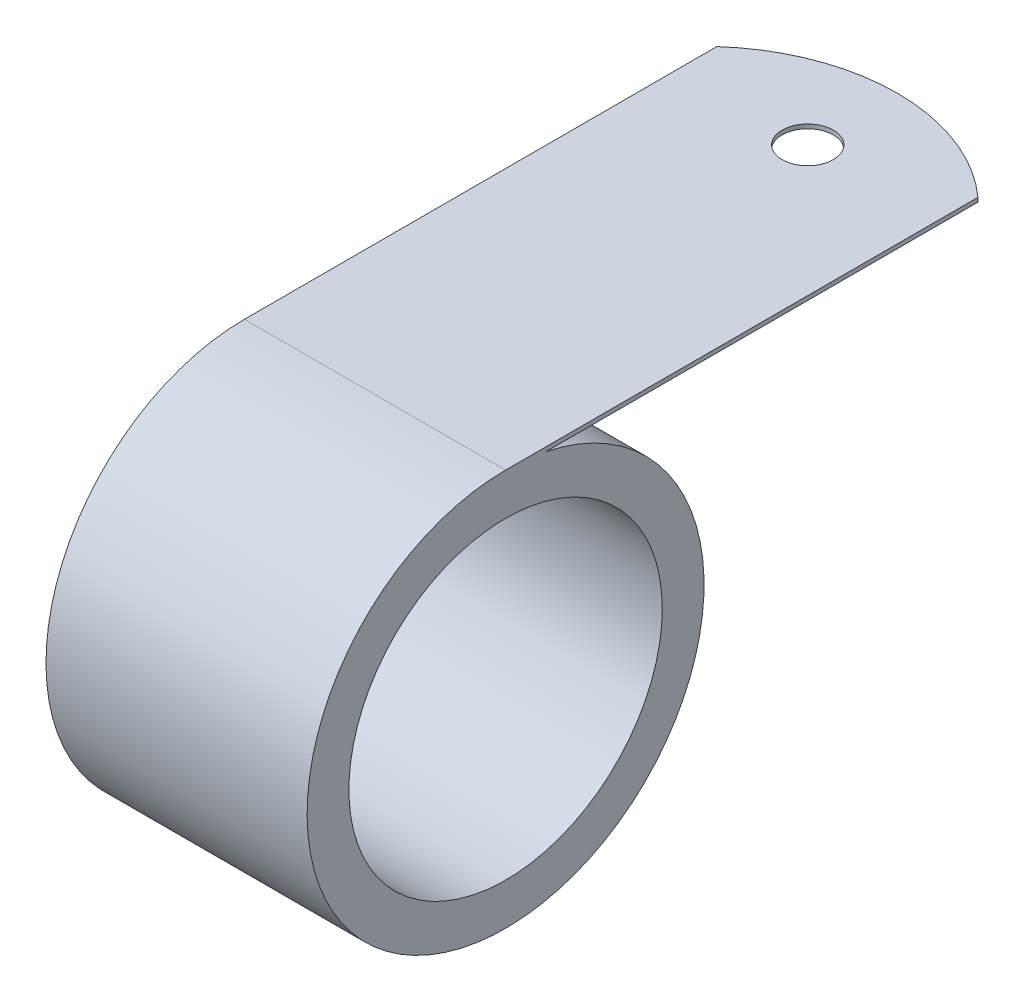
ISO-10303-21;
HEADER;
FILE_DESCRIPTION(('STEP AP214'),'2;1');
FILE_NAME('part.step','',(''),(''),'','','');
FILE_SCHEMA(('AUTOMOTIVE_DESIGN { 1 0 10303 214 1 1 1 1 }'));
ENDSEC;
DATA;
#1=APPLICATION_CONTEXT('core data for automotive mechanical design processes');
#2=APPLICATION_PROTOCOL_DEFINITION('international standard','automotive_design',2000,#1);
#3=PRODUCT_CONTEXT('',#1,'mechanical');
#4=PRODUCT('Part','Part','',(#3));
#5=PRODUCT_RELATED_PRODUCT_CATEGORY('part','',(#4));
#6=PRODUCT_DEFINITION_FORMATION('','',#4);
#7=PRODUCT_DEFINITION_CONTEXT('part definition',#1,'design');
#8=PRODUCT_DEFINITION('design','',#6,#7);
#9=PRODUCT_DEFINITION_SHAPE('','',#8);
#10=(LENGTH_UNIT() NAMED_UNIT(*) SI_UNIT(.MILLI.,.METRE.));
#11=(NAMED_UNIT(*) PLANE_ANGLE_UNIT() SI_UNIT($,.RADIAN.));
#12=(NAMED_UNIT(*) SI_UNIT($,.STERADIAN.) SOLID_ANGLE_UNIT());
#13=UNCERTAINTY_MEASURE_WITH_UNIT(LENGTH_MEASURE(1.E-05),#10,'distance_accuracy_value','');
#14=(GEOMETRIC_REPRESENTATION_CONTEXT(3) GLOBAL_UNCERTAINTY_ASSIGNED_CONTEXT((#13)) GLOBAL_UNIT_ASSIGNED_CONTEXT((#10,
#11,#12)) REPRESENTATION_CONTEXT('',''));
#15=CARTESIAN_POINT('',(0.,0.,0.));
#16=DIRECTION('',(0.,0.,1.));
#17=DIRECTION('',(1.,0.,0.));
#18=AXIS2_PLACEMENT_3D('',#15,#16,#17);
#19=CARTESIAN_POINT('',(12.7,0.,0.));
#20=DIRECTION('',(1.,0.,0.));
#21=DIRECTION('',(0.,0.,-1.));
#22=AXIS2_PLACEMENT_3D('',#19,#20,#21);
#23=PLANE('',#22);
#24=DIRECTION('',(0.,1.,0.));
#25=VECTOR('',#24,1.);
#26=CARTESIAN_POINT('',(12.7,-19.305,-45.9490316571237));
#27=LINE('',#26,#25);
#28=CARTESIAN_POINT('',(12.7,18.8976,-45.9490316571237));
#29=VERTEX_POINT('',#28);
#30=CARTESIAN_POINT('',(12.7,19.304,-45.9490316571237));
#31=VERTEX_POINT('',#30);
#32=EDGE_CURVE('E70',#29,#31,#27,.T.);
#33=ORIENTED_EDGE('',*,*,#32,.T.);
#34=DIRECTION('',(0.,0.,1.));
#35=VECTOR('',#34,1.);
#36=CARTESIAN_POINT('',(12.7,19.304,0.));
#37=LINE('',#36,#35);
#38=CARTESIAN_POINT('',(12.7,19.304,0.));
#39=VERTEX_POINT('',#38);
#40=EDGE_CURVE('E51',#31,#39,#37,.T.);
#41=ORIENTED_EDGE('',*,*,#40,.T.);
#42=CARTESIAN_POINT('',(12.7,0.,0.));
#43=DIRECTION('',(1.,0.,0.));
#44=DIRECTION('',(0.,0.,-1.));
#45=AXIS2_PLACEMENT_3D('',#42,#43,#44);
#46=CIRCLE('',#45,19.304);
#47=CARTESIAN_POINT('',(12.7,18.8976,-3.940194188108));
#48=VERTEX_POINT('',#47);
#49=EDGE_CURVE('E95',#39,#48,#46,.T.);
#50=ORIENTED_EDGE('',*,*,#49,.T.);
#51=DIRECTION('',(0.,0.,-1.));
#52=VECTOR('',#51,1.);
#53=CARTESIAN_POINT('',(12.7,18.8976,-3.940194188108));
#54=LINE('',#53,#52);
#55=EDGE_CURVE('E97',#48,#29,#54,.T.);
#56=ORIENTED_EDGE('',*,*,#55,.T.);
#57=EDGE_LOOP('',(#33,#41,#50,#56));
#58=FACE_BOUND('',#57,.T.);
#59=CARTESIAN_POINT('',(12.7,0.,0.));
#60=DIRECTION('',(1.,0.,0.));
#61=DIRECTION('',(0.,0.,-1.));
#62=AXIS2_PLACEMENT_3D('',#59,#60,#61);
#63=CIRCLE('',#62,15.24);
#64=CARTESIAN_POINT('',(12.7,0.,-15.24));
#65=VERTEX_POINT('',#64);
#66=EDGE_CURVE('E106',#65,#65,#63,.T.);
#67=ORIENTED_EDGE('',*,*,#66,.F.);
#68=EDGE_LOOP('',(#67));
#69=FACE_BOUND('',#68,.T.);
#70=ADVANCED_FACE('F34',(#58,#69),#23,.T.);
#71=CARTESIAN_POINT('',(-12.7,0.,0.));
#72=DIRECTION('',(1.,0.,0.));
#73=DIRECTION('',(0.,0.,-1.));
#74=AXIS2_PLACEMENT_3D('',#71,#72,#73);
#75=PLANE('',#74);
#76=DIRECTION('',(0.,0.,1.));
#77=VECTOR('',#76,1.);
#78=CARTESIAN_POINT('',(-12.7,19.304,0.));
#79=LINE('',#78,#77);
#80=CARTESIAN_POINT('',(-12.7,19.304,-45.9490316571237));
#81=VERTEX_POINT('',#80);
#82=CARTESIAN_POINT('',(-12.7,19.304,0.));
#83=VERTEX_POINT('',#82);
#84=EDGE_CURVE('E83',#81,#83,#79,.T.);
#85=ORIENTED_EDGE('',*,*,#84,.F.);
#86=DIRECTION('',(0.,1.,0.));
#87=VECTOR('',#86,1.);
#88=CARTESIAN_POINT('',(-12.7,-19.305,-45.9490316571237));
#89=LINE('',#88,#87);
#90=CARTESIAN_POINT('',(-12.7,18.8976,-45.9490316571237));
#91=VERTEX_POINT('',#90);
#92=EDGE_CURVE('E87',#91,#81,#89,.T.);
#93=ORIENTED_EDGE('',*,*,#92,.F.);
#94=DIRECTION('',(0.,0.,-1.));
#95=VECTOR('',#94,1.);
#96=CARTESIAN_POINT('',(-12.7,18.8976,-3.940194188108));
#97=LINE('',#96,#95);
#98=CARTESIAN_POINT('',(-12.7,18.8976,-3.940194188108));
#99=VERTEX_POINT('',#98);
#100=EDGE_CURVE('E63',#99,#91,#97,.T.);
#101=ORIENTED_EDGE('',*,*,#100,.F.);
#102=CARTESIAN_POINT('',(-12.7,0.,0.));
#103=DIRECTION('',(1.,0.,0.));
#104=DIRECTION('',(0.,0.,-1.));
#105=AXIS2_PLACEMENT_3D('',#102,#103,#104);
#106=CIRCLE('',#105,19.304);
#107=EDGE_CURVE('E94',#83,#99,#106,.T.);
#108=ORIENTED_EDGE('',*,*,#107,.F.);
#109=EDGE_LOOP('',(#85,#93,#101,#108));
#110=FACE_BOUND('',#109,.T.);
#111=CARTESIAN_POINT('',(-12.7,0.,0.));
#112=DIRECTION('',(1.,0.,0.));
#113=DIRECTION('',(0.,0.,-1.));
#114=AXIS2_PLACEMENT_3D('',#111,#112,#113);
#115=CIRCLE('',#114,15.24);
#116=CARTESIAN_POINT('',(-12.7,0.,-15.24));
#117=VERTEX_POINT('',#116);
#118=EDGE_CURVE('E109',#117,#117,#115,.T.);
#119=ORIENTED_EDGE('',*,*,#118,.T.);
#120=EDGE_LOOP('',(#119));
#121=FACE_BOUND('',#120,.T.);
#122=ADVANCED_FACE('F91',(#110,#121),#75,.F.);
#123=CARTESIAN_POINT('',(12.7,0.,0.));
#124=DIRECTION('',(-1.,0.,0.));
#125=DIRECTION('',(0.,0.,1.));
#126=AXIS2_PLACEMENT_3D('',#123,#124,#125);
#127=CYLINDRICAL_SURFACE('',#126,19.304);
#128=ORIENTED_EDGE('',*,*,#107,.T.);
#129=DIRECTION('',(-1.,0.,0.));
#130=VECTOR('',#129,1.);
#131=CARTESIAN_POINT('',(12.7,18.8976,-3.940194188108));
#132=LINE('',#131,#130);
#133=EDGE_CURVE('E11',#48,#99,#132,.T.);
#134=ORIENTED_EDGE('',*,*,#133,.F.);
#135=ORIENTED_EDGE('',*,*,#49,.F.);
#136=DIRECTION('',(-1.,0.,0.));
#137=VECTOR('',#136,1.);
#138=CARTESIAN_POINT('',(12.7,19.304,0.));
#139=LINE('',#138,#137);
#140=EDGE_CURVE('E43',#39,#83,#139,.T.);
#141=ORIENTED_EDGE('',*,*,#140,.T.);
#142=EDGE_LOOP('',(#128,#134,#135,#141));
#143=FACE_BOUND('',#142,.T.);
#144=ADVANCED_FACE('F36',(#143),#127,.T.);
#145=CARTESIAN_POINT('',(12.7,18.8976,-3.940194188108));
#146=DIRECTION('',(0.,1.,0.));
#147=DIRECTION('',(0.,0.,1.));
#148=AXIS2_PLACEMENT_3D('',#145,#146,#147);
#149=PLANE('',#148);
#150=CARTESIAN_POINT('',(0.,18.8976,-42.0878));
#151=DIRECTION('',(0.,1.,0.));
#152=DIRECTION('',(0.,0.,1.));
#153=AXIS2_PLACEMENT_3D('',#150,#151,#152);
#154=CIRCLE('',#153,2.4892);
#155=CARTESIAN_POINT('',(0.,18.8976,-39.5986));
#156=VERTEX_POINT('',#155);
#157=EDGE_CURVE('E118',#156,#156,#154,.F.);
#158=ORIENTED_EDGE('',*,*,#157,.F.);
#159=EDGE_LOOP('',(#158));
#160=FACE_BOUND('',#159,.T.);
#161=ORIENTED_EDGE('',*,*,#100,.T.);
#162=CARTESIAN_POINT('',(0.,18.8976,-31.75));
#163=DIRECTION('',(0.,1.,0.));
#164=DIRECTION('',(0.,0.,1.));
#165=AXIS2_PLACEMENT_3D('',#162,#163,#164);
#166=CIRCLE('',#165,19.05);
#167=EDGE_CURVE('E85',#29,#91,#166,.T.);
#168=ORIENTED_EDGE('',*,*,#167,.F.);
#169=ORIENTED_EDGE('',*,*,#55,.F.);
#170=ORIENTED_EDGE('',*,*,#133,.T.);
#171=EDGE_LOOP('',(#161,#168,#169,#170));
#172=FACE_BOUND('',#171,.T.);
#173=ADVANCED_FACE('F129',(#160,#172),#149,.F.);
#174=CARTESIAN_POINT('',(12.7,19.304,0.));
#175=DIRECTION('',(0.,-1.,0.));
#176=DIRECTION('',(0.,0.,-1.));
#177=AXIS2_PLACEMENT_3D('',#174,#175,#176);
#178=PLANE('',#177);
#179=CARTESIAN_POINT('',(0.,19.304,-42.0878));
#180=DIRECTION('',(0.,1.,0.));
#181=DIRECTION('',(0.,0.,1.));
#182=AXIS2_PLACEMENT_3D('',#179,#180,#181);
#183=CIRCLE('',#182,2.4892);
#184=CARTESIAN_POINT('',(0.,19.304,-39.5986));
#185=VERTEX_POINT('',#184);
#186=EDGE_CURVE('E89',#185,#185,#183,.T.);
#187=ORIENTED_EDGE('',*,*,#186,.F.);
#188=EDGE_LOOP('',(#187));
#189=FACE_BOUND('',#188,.T.);
#190=CARTESIAN_POINT('',(0.,19.304,-31.75));
#191=DIRECTION('',(0.,-1.,0.));
#192=DIRECTION('',(0.,0.,1.));
#193=AXIS2_PLACEMENT_3D('',#190,#191,#192);
#194=CIRCLE('',#193,19.05);
#195=EDGE_CURVE('E79',#81,#31,#194,.T.);
#196=ORIENTED_EDGE('',*,*,#195,.F.);
#197=ORIENTED_EDGE('',*,*,#84,.T.);
#198=ORIENTED_EDGE('',*,*,#140,.F.);
#199=ORIENTED_EDGE('',*,*,#40,.F.);
#200=EDGE_LOOP('',(#196,#197,#198,#199));
#201=FACE_BOUND('',#200,.T.);
#202=ADVANCED_FACE('F81',(#189,#201),#178,.F.);
#203=CARTESIAN_POINT('',(12.7,0.,0.));
#204=DIRECTION('',(-1.,0.,0.));
#205=DIRECTION('',(0.,0.,1.));
#206=AXIS2_PLACEMENT_3D('',#203,#204,#205);
#207=CYLINDRICAL_SURFACE('',#206,15.24);
#208=ORIENTED_EDGE('',*,*,#66,.T.);
#209=EDGE_LOOP('',(#208));
#210=FACE_BOUND('',#209,.T.);
#211=ORIENTED_EDGE('',*,*,#118,.F.);
#212=EDGE_LOOP('',(#211));
#213=FACE_BOUND('',#212,.T.);
#214=ADVANCED_FACE('F128',(#210,#213),#207,.F.);
#215=CARTESIAN_POINT('',(0.,-19.305,-31.75));
#216=DIRECTION('',(0.,1.,0.));
#217=DIRECTION('',(0.,0.,1.));
#218=AXIS2_PLACEMENT_3D('',#215,#216,#217);
#219=CYLINDRICAL_SURFACE('',#218,19.05);
#220=ORIENTED_EDGE('',*,*,#167,.T.);
#221=ORIENTED_EDGE('',*,*,#92,.T.);
#222=ORIENTED_EDGE('',*,*,#195,.T.);
#223=ORIENTED_EDGE('',*,*,#32,.F.);
#224=EDGE_LOOP('',(#220,#221,#222,#223));
#225=FACE_BOUND('',#224,.T.);
#226=ADVANCED_FACE('F88',(#225),#219,.T.);
#227=CARTESIAN_POINT('',(0.,-19.305,-42.0878));
#228=DIRECTION('',(0.,1.,0.));
#229=DIRECTION('',(0.,0.,1.));
#230=AXIS2_PLACEMENT_3D('',#227,#228,#229);
#231=CYLINDRICAL_SURFACE('',#230,2.4892);
#232=ORIENTED_EDGE('',*,*,#186,.T.);
#233=EDGE_LOOP('',(#232));
#234=FACE_BOUND('',#233,.T.);
#235=ORIENTED_EDGE('',*,*,#157,.T.);
#236=EDGE_LOOP('',(#235));
#237=FACE_BOUND('',#236,.T.);
#238=ADVANCED_FACE('F124',(#234,#237),#231,.F.);
#239=CLOSED_SHELL('',(#70,#122,#144,#173,#202,#214,#226,#238));
#240=MANIFOLD_SOLID_BREP('B2',#239);
#241=ADVANCED_BREP_SHAPE_REPRESENTATION('',(#18,#240),#14);
#242=SHAPE_DEFINITION_REPRESENTATION(#9,#241);
ENDSEC;
END-ISO-10303-21;
